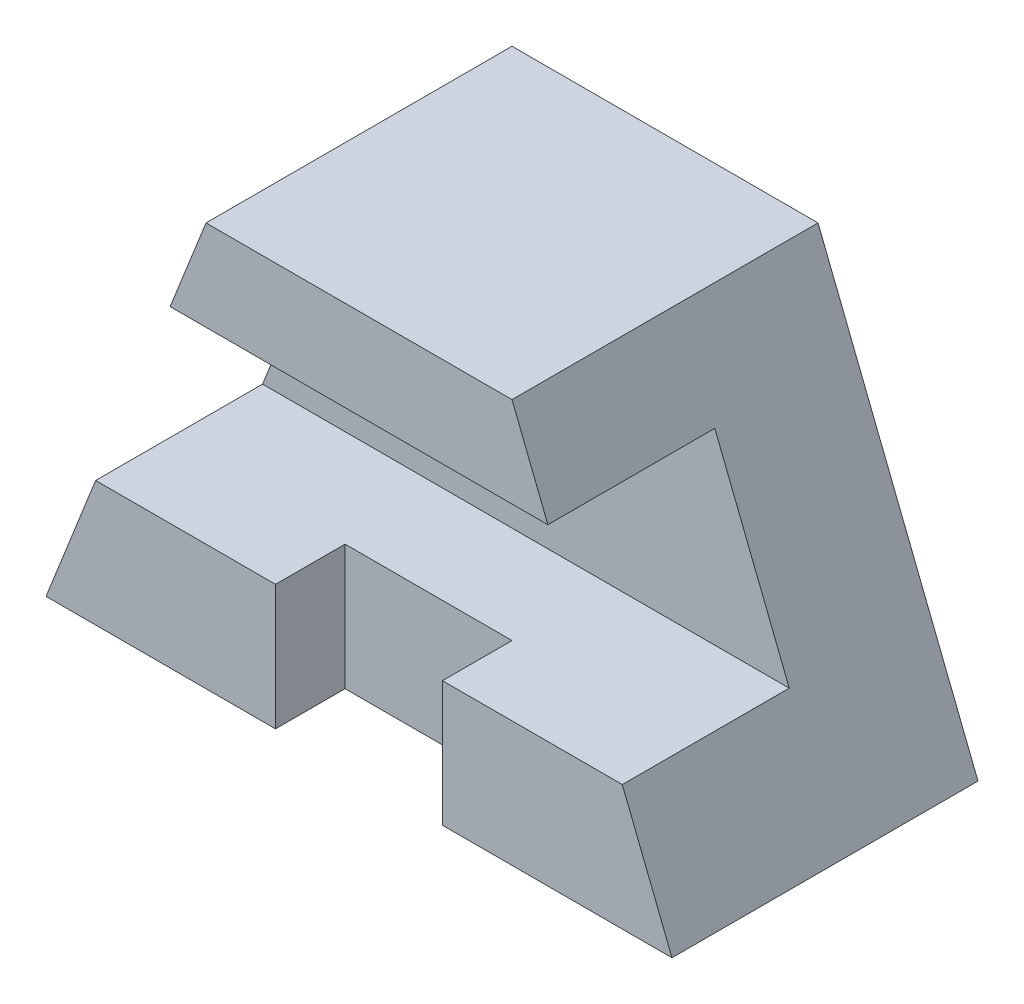
ISO-10303-21;
HEADER;
FILE_DESCRIPTION(('STEP AP214'),'2;1');
FILE_NAME('part.step','',(''),(''),'','','');
FILE_SCHEMA(('AUTOMOTIVE_DESIGN { 1 0 10303 214 1 1 1 1 }'));
ENDSEC;
DATA;
#1=APPLICATION_CONTEXT('core data for automotive mechanical design processes');
#2=APPLICATION_PROTOCOL_DEFINITION('international standard','automotive_design',2000,#1);
#3=PRODUCT_CONTEXT('',#1,'mechanical');
#4=PRODUCT('Part','Part','',(#3));
#5=PRODUCT_RELATED_PRODUCT_CATEGORY('part','',(#4));
#6=PRODUCT_DEFINITION_FORMATION('','',#4);
#7=PRODUCT_DEFINITION_CONTEXT('part definition',#1,'design');
#8=PRODUCT_DEFINITION('design','',#6,#7);
#9=PRODUCT_DEFINITION_SHAPE('','',#8);
#10=(LENGTH_UNIT() NAMED_UNIT(*) SI_UNIT(.MILLI.,.METRE.));
#11=(NAMED_UNIT(*) PLANE_ANGLE_UNIT() SI_UNIT($,.RADIAN.));
#12=(NAMED_UNIT(*) SI_UNIT($,.STERADIAN.) SOLID_ANGLE_UNIT());
#13=UNCERTAINTY_MEASURE_WITH_UNIT(LENGTH_MEASURE(1.E-05),#10,'distance_accuracy_value','');
#14=(GEOMETRIC_REPRESENTATION_CONTEXT(3) GLOBAL_UNCERTAINTY_ASSIGNED_CONTEXT((#13)) GLOBAL_UNIT_ASSIGNED_CONTEXT((#10,
#11,#12)) REPRESENTATION_CONTEXT('',''));
#15=CARTESIAN_POINT('',(0.,0.,0.));
#16=DIRECTION('',(0.,0.,1.));
#17=DIRECTION('',(1.,0.,0.));
#18=AXIS2_PLACEMENT_3D('',#15,#16,#17);
#19=CARTESIAN_POINT('',(0.,0.,22.));
#20=DIRECTION('',(0.,0.,-1.));
#21=DIRECTION('',(-1.,0.,0.));
#22=AXIS2_PLACEMENT_3D('',#19,#20,#21);
#23=PLANE('',#22);
#24=DIRECTION('',(1.,0.,0.));
#25=VECTOR('',#24,1.);
#26=CARTESIAN_POINT('',(-45.,18.,22.));
#27=LINE('',#26,#25);
#28=CARTESIAN_POINT('',(12.,18.,22.));
#29=VERTEX_POINT('',#28);
#30=CARTESIAN_POINT('',(37.8620689655172,18.,22.));
#31=VERTEX_POINT('',#30);
#32=EDGE_CURVE('E137',#29,#31,#27,.T.);
#33=ORIENTED_EDGE('',*,*,#32,.F.);
#34=DIRECTION('',(0.,-1.,0.));
#35=VECTOR('',#34,1.);
#36=CARTESIAN_POINT('',(12.,58.001,22.));
#37=LINE('',#36,#35);
#38=CARTESIAN_POINT('',(12.,0.,22.));
#39=VERTEX_POINT('',#38);
#40=EDGE_CURVE('E122',#29,#39,#37,.T.);
#41=ORIENTED_EDGE('',*,*,#40,.T.);
#42=DIRECTION('',(1.,0.,0.));
#43=VECTOR('',#42,1.);
#44=CARTESIAN_POINT('',(45.,0.,22.));
#45=LINE('',#44,#43);
#46=CARTESIAN_POINT('',(45.,0.,22.));
#47=VERTEX_POINT('',#46);
#48=EDGE_CURVE('E160',#39,#47,#45,.T.);
#49=ORIENTED_EDGE('',*,*,#48,.T.);
#50=DIRECTION('',(-0.368625720283123,0.929577903322658,0.));
#51=VECTOR('',#50,1.);
#52=CARTESIAN_POINT('',(45.,0.,22.));
#53=LINE('',#52,#51);
#54=EDGE_CURVE('E145',#47,#31,#53,.T.);
#55=ORIENTED_EDGE('',*,*,#54,.T.);
#56=EDGE_LOOP('',(#33,#41,#49,#55));
#57=FACE_BOUND('',#56,.T.);
#58=ADVANCED_FACE('F33',(#57),#23,.F.);
#59=CARTESIAN_POINT('',(-45.,0.,22.));
#60=VERTEX_POINT('',#59);
#61=CARTESIAN_POINT('',(-12.,0.,22.));
#62=VERTEX_POINT('',#61);
#63=EDGE_CURVE('E156',#60,#62,#45,.T.);
#64=ORIENTED_EDGE('',*,*,#63,.T.);
#65=DIRECTION('',(0.,-1.,0.));
#66=VECTOR('',#65,1.);
#67=CARTESIAN_POINT('',(-12.,58.001,22.));
#68=LINE('',#67,#66);
#69=CARTESIAN_POINT('',(-12.,18.,22.));
#70=VERTEX_POINT('',#69);
#71=EDGE_CURVE('E48',#70,#62,#68,.T.);
#72=ORIENTED_EDGE('',*,*,#71,.F.);
#73=CARTESIAN_POINT('',(-37.8620689655172,18.,22.));
#74=VERTEX_POINT('',#73);
#75=EDGE_CURVE('E146',#74,#70,#27,.T.);
#76=ORIENTED_EDGE('',*,*,#75,.F.);
#77=DIRECTION('',(0.368625720283123,0.929577903322658,0.));
#78=VECTOR('',#77,1.);
#79=CARTESIAN_POINT('',(-45.,0.,22.));
#80=LINE('',#79,#78);
#81=EDGE_CURVE('E204',#60,#74,#80,.T.);
#82=ORIENTED_EDGE('',*,*,#81,.F.);
#83=EDGE_LOOP('',(#64,#72,#76,#82));
#84=FACE_BOUND('',#83,.T.);
#85=ADVANCED_FACE('F225',(#84),#23,.F.);
#86=CARTESIAN_POINT('',(45.,58.,22.));
#87=DIRECTION('',(0.,-1.,0.));
#88=DIRECTION('',(0.,0.,-1.));
#89=AXIS2_PLACEMENT_3D('',#86,#87,#88);
#90=PLANE('',#89);
#91=DIRECTION('',(0.,0.,-1.));
#92=VECTOR('',#91,1.);
#93=CARTESIAN_POINT('',(-22.,58.,22.));
#94=LINE('',#93,#92);
#95=CARTESIAN_POINT('',(-22.,58.,22.));
#96=VERTEX_POINT('',#95);
#97=CARTESIAN_POINT('',(-22.,58.,-22.));
#98=VERTEX_POINT('',#97);
#99=EDGE_CURVE('E202',#96,#98,#94,.T.);
#100=ORIENTED_EDGE('',*,*,#99,.F.);
#101=DIRECTION('',(-1.,0.,0.));
#102=VECTOR('',#101,1.);
#103=CARTESIAN_POINT('',(45.,58.,22.));
#104=LINE('',#103,#102);
#105=CARTESIAN_POINT('',(22.,58.,22.));
#106=VERTEX_POINT('',#105);
#107=EDGE_CURVE('E159',#106,#96,#104,.T.);
#108=ORIENTED_EDGE('',*,*,#107,.F.);
#109=DIRECTION('',(0.,0.,-1.));
#110=VECTOR('',#109,1.);
#111=CARTESIAN_POINT('',(22.,58.,22.));
#112=LINE('',#111,#110);
#113=CARTESIAN_POINT('',(22.,58.,-22.));
#114=VERTEX_POINT('',#113);
#115=EDGE_CURVE('E193',#106,#114,#112,.T.);
#116=ORIENTED_EDGE('',*,*,#115,.T.);
#117=DIRECTION('',(-1.,0.,0.));
#118=VECTOR('',#117,1.);
#119=CARTESIAN_POINT('',(45.,58.,-22.));
#120=LINE('',#119,#118);
#121=EDGE_CURVE('E167',#114,#98,#120,.T.);
#122=ORIENTED_EDGE('',*,*,#121,.T.);
#123=EDGE_LOOP('',(#100,#108,#116,#122));
#124=FACE_BOUND('',#123,.T.);
#125=ADVANCED_FACE('F240',(#124),#90,.F.);
#126=CARTESIAN_POINT('',(-27.1551724137931,45.,22.));
#127=VERTEX_POINT('',#126);
#128=EDGE_CURVE('E208',#127,#96,#80,.T.);
#129=ORIENTED_EDGE('',*,*,#128,.F.);
#130=DIRECTION('',(-1.,0.,0.));
#131=VECTOR('',#130,1.);
#132=CARTESIAN_POINT('',(-45.,45.,22.));
#133=LINE('',#132,#131);
#134=CARTESIAN_POINT('',(27.1551724137931,45.,22.));
#135=VERTEX_POINT('',#134);
#136=EDGE_CURVE('E147',#135,#127,#133,.T.);
#137=ORIENTED_EDGE('',*,*,#136,.F.);
#138=EDGE_CURVE('E198',#135,#106,#53,.T.);
#139=ORIENTED_EDGE('',*,*,#138,.T.);
#140=ORIENTED_EDGE('',*,*,#107,.T.);
#141=EDGE_LOOP('',(#129,#137,#139,#140));
#142=FACE_BOUND('',#141,.T.);
#143=ADVANCED_FACE('F243',(#142),#23,.F.);
#144=CARTESIAN_POINT('',(0.,0.,-22.));
#145=DIRECTION('',(0.,0.,-1.));
#146=DIRECTION('',(-1.,0.,0.));
#147=AXIS2_PLACEMENT_3D('',#144,#145,#146);
#148=PLANE('',#147);
#149=DIRECTION('',(1.,0.,0.));
#150=VECTOR('',#149,1.);
#151=CARTESIAN_POINT('',(45.,0.,-22.));
#152=LINE('',#151,#150);
#153=CARTESIAN_POINT('',(-45.,0.,-22.));
#154=VERTEX_POINT('',#153);
#155=CARTESIAN_POINT('',(45.,0.,-22.));
#156=VERTEX_POINT('',#155);
#157=EDGE_CURVE('E164',#154,#156,#152,.T.);
#158=ORIENTED_EDGE('',*,*,#157,.F.);
#159=DIRECTION('',(0.368625720283123,0.929577903322658,0.));
#160=VECTOR('',#159,1.);
#161=CARTESIAN_POINT('',(-45.,0.,-22.));
#162=LINE('',#161,#160);
#163=EDGE_CURVE('E205',#154,#98,#162,.T.);
#164=ORIENTED_EDGE('',*,*,#163,.T.);
#165=ORIENTED_EDGE('',*,*,#121,.F.);
#166=DIRECTION('',(-0.368625720283123,0.929577903322658,0.));
#167=VECTOR('',#166,1.);
#168=CARTESIAN_POINT('',(45.,0.,-22.));
#169=LINE('',#168,#167);
#170=EDGE_CURVE('E196',#156,#114,#169,.T.);
#171=ORIENTED_EDGE('',*,*,#170,.F.);
#172=EDGE_LOOP('',(#158,#164,#165,#171));
#173=FACE_BOUND('',#172,.T.);
#174=ADVANCED_FACE('F234',(#173),#148,.T.);
#175=CARTESIAN_POINT('',(-45.,18.,-2.));
#176=DIRECTION('',(0.,-1.,0.));
#177=DIRECTION('',(1.,0.,0.));
#178=AXIS2_PLACEMENT_3D('',#175,#176,#177);
#179=PLANE('',#178);
#180=DIRECTION('',(-1.,0.,0.));
#181=VECTOR('',#180,1.);
#182=CARTESIAN_POINT('',(-12.,18.,12.));
#183=LINE('',#182,#181);
#184=CARTESIAN_POINT('',(12.,18.,12.));
#185=VERTEX_POINT('',#184);
#186=CARTESIAN_POINT('',(-12.,18.,12.));
#187=VERTEX_POINT('',#186);
#188=EDGE_CURVE('E141',#185,#187,#183,.T.);
#189=ORIENTED_EDGE('',*,*,#188,.F.);
#190=DIRECTION('',(0.,0.,-1.));
#191=VECTOR('',#190,1.);
#192=CARTESIAN_POINT('',(12.,18.,12.));
#193=LINE('',#192,#191);
#194=EDGE_CURVE('E125',#29,#185,#193,.T.);
#195=ORIENTED_EDGE('',*,*,#194,.F.);
#196=ORIENTED_EDGE('',*,*,#32,.T.);
#197=DIRECTION('',(0.,0.,-1.));
#198=VECTOR('',#197,1.);
#199=CARTESIAN_POINT('',(37.8620689655172,18.,-2.));
#200=LINE('',#199,#198);
#201=CARTESIAN_POINT('',(37.8620689655172,18.,-2.));
#202=VERTEX_POINT('',#201);
#203=EDGE_CURVE('E152',#31,#202,#200,.T.);
#204=ORIENTED_EDGE('',*,*,#203,.T.);
#205=DIRECTION('',(1.,0.,0.));
#206=VECTOR('',#205,1.);
#207=CARTESIAN_POINT('',(-45.,18.,-2.));
#208=LINE('',#207,#206);
#209=CARTESIAN_POINT('',(-37.8620689655172,18.,-2.));
#210=VERTEX_POINT('',#209);
#211=EDGE_CURVE('E168',#210,#202,#208,.T.);
#212=ORIENTED_EDGE('',*,*,#211,.F.);
#213=DIRECTION('',(0.,0.,-1.));
#214=VECTOR('',#213,1.);
#215=CARTESIAN_POINT('',(-37.8620689655172,18.,-2.));
#216=LINE('',#215,#214);
#217=EDGE_CURVE('E55',#74,#210,#216,.T.);
#218=ORIENTED_EDGE('',*,*,#217,.F.);
#219=ORIENTED_EDGE('',*,*,#75,.T.);
#220=DIRECTION('',(0.,0.,1.));
#221=VECTOR('',#220,1.);
#222=CARTESIAN_POINT('',(-12.,18.,12.));
#223=LINE('',#222,#221);
#224=EDGE_CURVE('E221',#187,#70,#223,.T.);
#225=ORIENTED_EDGE('',*,*,#224,.F.);
#226=EDGE_LOOP('',(#189,#195,#196,#204,#212,#218,#219,#225));
#227=FACE_BOUND('',#226,.T.);
#228=ADVANCED_FACE('F135',(#227),#179,.F.);
#229=CARTESIAN_POINT('',(-45.,45.,-2.));
#230=DIRECTION('',(0.,1.,0.));
#231=DIRECTION('',(0.,0.,1.));
#232=AXIS2_PLACEMENT_3D('',#229,#230,#231);
#233=PLANE('',#232);
#234=DIRECTION('',(0.,0.,1.));
#235=VECTOR('',#234,1.);
#236=CARTESIAN_POINT('',(-27.1551724137931,45.,-2.));
#237=LINE('',#236,#235);
#238=CARTESIAN_POINT('',(-27.1551724137931,45.,-2.));
#239=VERTEX_POINT('',#238);
#240=EDGE_CURVE('E188',#239,#127,#237,.T.);
#241=ORIENTED_EDGE('',*,*,#240,.F.);
#242=DIRECTION('',(-1.,0.,0.));
#243=VECTOR('',#242,1.);
#244=CARTESIAN_POINT('',(-45.,45.,-2.));
#245=LINE('',#244,#243);
#246=CARTESIAN_POINT('',(27.1551724137931,45.,-2.));
#247=VERTEX_POINT('',#246);
#248=EDGE_CURVE('E150',#247,#239,#245,.T.);
#249=ORIENTED_EDGE('',*,*,#248,.F.);
#250=DIRECTION('',(0.,0.,1.));
#251=VECTOR('',#250,1.);
#252=CARTESIAN_POINT('',(27.1551724137931,45.,-2.));
#253=LINE('',#252,#251);
#254=EDGE_CURVE('E186',#247,#135,#253,.T.);
#255=ORIENTED_EDGE('',*,*,#254,.T.);
#256=ORIENTED_EDGE('',*,*,#136,.T.);
#257=EDGE_LOOP('',(#241,#249,#255,#256));
#258=FACE_BOUND('',#257,.T.);
#259=ADVANCED_FACE('F185',(#258),#233,.F.);
#260=CARTESIAN_POINT('',(0.,0.,-2.));
#261=DIRECTION('',(0.,0.,-1.));
#262=DIRECTION('',(-1.,0.,0.));
#263=AXIS2_PLACEMENT_3D('',#260,#261,#262);
#264=PLANE('',#263);
#265=DIRECTION('',(0.368625720283123,0.929577903322658,0.));
#266=VECTOR('',#265,1.);
#267=CARTESIAN_POINT('',(-38.8851785255587,15.4199845877216,-2.));
#268=LINE('',#267,#266);
#269=EDGE_CURVE('E11',#210,#239,#268,.T.);
#270=ORIENTED_EDGE('',*,*,#269,.F.);
#271=ORIENTED_EDGE('',*,*,#211,.T.);
#272=DIRECTION('',(-0.368625720283123,0.929577903322658,0.));
#273=VECTOR('',#272,1.);
#274=CARTESIAN_POINT('',(38.8851785255587,15.4199845877216,-2.));
#275=LINE('',#274,#273);
#276=EDGE_CURVE('E41',#202,#247,#275,.T.);
#277=ORIENTED_EDGE('',*,*,#276,.T.);
#278=ORIENTED_EDGE('',*,*,#248,.T.);
#279=EDGE_LOOP('',(#270,#271,#277,#278));
#280=FACE_BOUND('',#279,.T.);
#281=ADVANCED_FACE('F179',(#280),#264,.F.);
#282=CARTESIAN_POINT('',(45.,0.,22.));
#283=DIRECTION('',(0.,1.,0.));
#284=DIRECTION('',(0.,0.,1.));
#285=AXIS2_PLACEMENT_3D('',#282,#283,#284);
#286=PLANE('',#285);
#287=ORIENTED_EDGE('',*,*,#48,.F.);
#288=DIRECTION('',(0.,0.,1.));
#289=VECTOR('',#288,1.);
#290=CARTESIAN_POINT('',(12.,0.,12.));
#291=LINE('',#290,#289);
#292=CARTESIAN_POINT('',(12.,0.,12.));
#293=VERTEX_POINT('',#292);
#294=EDGE_CURVE('E128',#293,#39,#291,.T.);
#295=ORIENTED_EDGE('',*,*,#294,.F.);
#296=DIRECTION('',(1.,0.,0.));
#297=VECTOR('',#296,1.);
#298=CARTESIAN_POINT('',(-12.,0.,12.));
#299=LINE('',#298,#297);
#300=CARTESIAN_POINT('',(-12.,0.,12.));
#301=VERTEX_POINT('',#300);
#302=EDGE_CURVE('E132',#301,#293,#299,.T.);
#303=ORIENTED_EDGE('',*,*,#302,.F.);
#304=DIRECTION('',(0.,0.,-1.));
#305=VECTOR('',#304,1.);
#306=CARTESIAN_POINT('',(-12.,0.,12.));
#307=LINE('',#306,#305);
#308=EDGE_CURVE('E217',#62,#301,#307,.T.);
#309=ORIENTED_EDGE('',*,*,#308,.F.);
#310=ORIENTED_EDGE('',*,*,#63,.F.);
#311=DIRECTION('',(0.,0.,-1.));
#312=VECTOR('',#311,1.);
#313=CARTESIAN_POINT('',(-45.,0.,22.));
#314=LINE('',#313,#312);
#315=EDGE_CURVE('E172',#60,#154,#314,.T.);
#316=ORIENTED_EDGE('',*,*,#315,.T.);
#317=ORIENTED_EDGE('',*,*,#157,.T.);
#318=DIRECTION('',(0.,0.,-1.));
#319=VECTOR('',#318,1.);
#320=CARTESIAN_POINT('',(45.,0.,22.));
#321=LINE('',#320,#319);
#322=EDGE_CURVE('E163',#47,#156,#321,.T.);
#323=ORIENTED_EDGE('',*,*,#322,.F.);
#324=EDGE_LOOP('',(#287,#295,#303,#309,#310,#316,#317,#323));
#325=FACE_BOUND('',#324,.T.);
#326=ADVANCED_FACE('F35',(#325),#286,.F.);
#327=CARTESIAN_POINT('',(45.,0.,22.));
#328=DIRECTION('',(-0.929577903322658,-0.368625720283123,0.));
#329=DIRECTION('',(0.368625720283123,-0.929577903322658,0.));
#330=AXIS2_PLACEMENT_3D('',#327,#328,#329);
#331=PLANE('',#330);
#332=ORIENTED_EDGE('',*,*,#54,.F.);
#333=ORIENTED_EDGE('',*,*,#322,.T.);
#334=ORIENTED_EDGE('',*,*,#170,.T.);
#335=ORIENTED_EDGE('',*,*,#115,.F.);
#336=ORIENTED_EDGE('',*,*,#138,.F.);
#337=ORIENTED_EDGE('',*,*,#254,.F.);
#338=ORIENTED_EDGE('',*,*,#276,.F.);
#339=ORIENTED_EDGE('',*,*,#203,.F.);
#340=EDGE_LOOP('',(#332,#333,#334,#335,#336,#337,#338,#339));
#341=FACE_BOUND('',#340,.T.);
#342=ADVANCED_FACE('F228',(#341),#331,.F.);
#343=CARTESIAN_POINT('',(-45.,0.,22.));
#344=DIRECTION('',(-0.929577903322658,0.368625720283123,0.));
#345=DIRECTION('',(-0.368625720283123,-0.929577903322658,0.));
#346=AXIS2_PLACEMENT_3D('',#343,#344,#345);
#347=PLANE('',#346);
#348=ORIENTED_EDGE('',*,*,#217,.T.);
#349=ORIENTED_EDGE('',*,*,#269,.T.);
#350=ORIENTED_EDGE('',*,*,#240,.T.);
#351=ORIENTED_EDGE('',*,*,#128,.T.);
#352=ORIENTED_EDGE('',*,*,#99,.T.);
#353=ORIENTED_EDGE('',*,*,#163,.F.);
#354=ORIENTED_EDGE('',*,*,#315,.F.);
#355=ORIENTED_EDGE('',*,*,#81,.T.);
#356=EDGE_LOOP('',(#348,#349,#350,#351,#352,#353,#354,#355));
#357=FACE_BOUND('',#356,.T.);
#358=ADVANCED_FACE('F244',(#357),#347,.T.);
#359=CARTESIAN_POINT('',(12.,58.001,12.));
#360=DIRECTION('',(1.,0.,0.));
#361=DIRECTION('',(0.,0.,-1.));
#362=AXIS2_PLACEMENT_3D('',#359,#360,#361);
#363=PLANE('',#362);
#364=ORIENTED_EDGE('',*,*,#194,.T.);
#365=DIRECTION('',(0.,-1.,0.));
#366=VECTOR('',#365,1.);
#367=CARTESIAN_POINT('',(12.,58.001,12.));
#368=LINE('',#367,#366);
#369=EDGE_CURVE('E209',#185,#293,#368,.T.);
#370=ORIENTED_EDGE('',*,*,#369,.T.);
#371=ORIENTED_EDGE('',*,*,#294,.T.);
#372=ORIENTED_EDGE('',*,*,#40,.F.);
#373=EDGE_LOOP('',(#364,#370,#371,#372));
#374=FACE_BOUND('',#373,.T.);
#375=ADVANCED_FACE('F124',(#374),#363,.F.);
#376=CARTESIAN_POINT('',(-12.,58.001,12.));
#377=DIRECTION('',(0.,0.,-1.));
#378=DIRECTION('',(-1.,0.,0.));
#379=AXIS2_PLACEMENT_3D('',#376,#377,#378);
#380=PLANE('',#379);
#381=ORIENTED_EDGE('',*,*,#188,.T.);
#382=DIRECTION('',(0.,-1.,0.));
#383=VECTOR('',#382,1.);
#384=CARTESIAN_POINT('',(-12.,58.001,12.));
#385=LINE('',#384,#383);
#386=EDGE_CURVE('E212',#187,#301,#385,.T.);
#387=ORIENTED_EDGE('',*,*,#386,.T.);
#388=ORIENTED_EDGE('',*,*,#302,.T.);
#389=ORIENTED_EDGE('',*,*,#369,.F.);
#390=EDGE_LOOP('',(#381,#387,#388,#389));
#391=FACE_BOUND('',#390,.T.);
#392=ADVANCED_FACE('F247',(#391),#380,.F.);
#393=CARTESIAN_POINT('',(-12.,58.001,12.));
#394=DIRECTION('',(-1.,0.,0.));
#395=DIRECTION('',(0.,0.,1.));
#396=AXIS2_PLACEMENT_3D('',#393,#394,#395);
#397=PLANE('',#396);
#398=ORIENTED_EDGE('',*,*,#224,.T.);
#399=ORIENTED_EDGE('',*,*,#71,.T.);
#400=ORIENTED_EDGE('',*,*,#308,.T.);
#401=ORIENTED_EDGE('',*,*,#386,.F.);
#402=EDGE_LOOP('',(#398,#399,#400,#401));
#403=FACE_BOUND('',#402,.T.);
#404=ADVANCED_FACE('F222',(#403),#397,.F.);
#405=CLOSED_SHELL('',(#58,#85,#125,#143,#174,#228,#259,#281,#326,#342,#358,#375,#392,#404));
#406=MANIFOLD_SOLID_BREP('B2',#405);
#407=ADVANCED_BREP_SHAPE_REPRESENTATION('',(#18,#406),#14);
#408=SHAPE_DEFINITION_REPRESENTATION(#9,#407);
ENDSEC;
END-ISO-10303-21;
